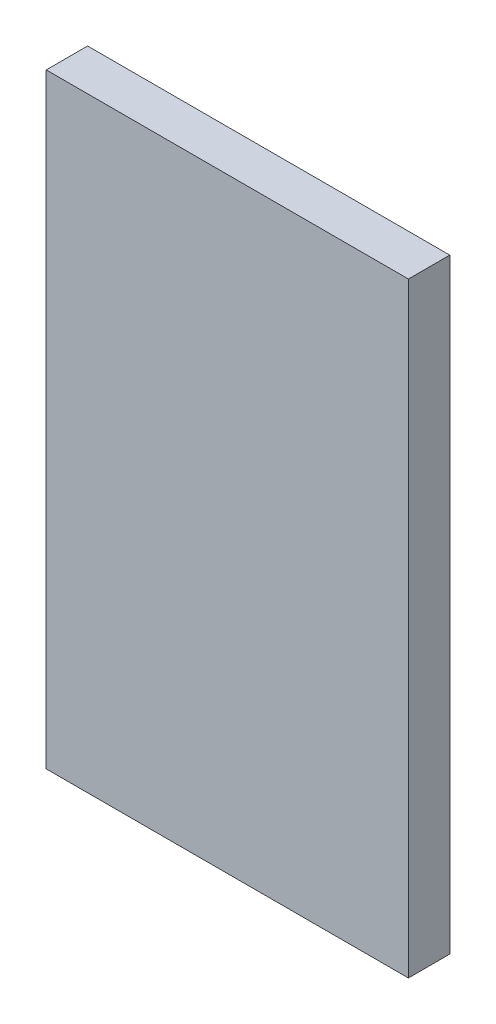
ISO-10303-21;
HEADER;
FILE_DESCRIPTION(('STEP AP214'),'2;1');
FILE_NAME('part.step','',(''),(''),'','','');
FILE_SCHEMA(('AUTOMOTIVE_DESIGN { 1 0 10303 214 1 1 1 1 }'));
ENDSEC;
DATA;
#1=APPLICATION_CONTEXT('core data for automotive mechanical design processes');
#2=APPLICATION_PROTOCOL_DEFINITION('international standard','automotive_design',2000,#1);
#3=PRODUCT_CONTEXT('',#1,'mechanical');
#4=PRODUCT('Part','Part','',(#3));
#5=PRODUCT_RELATED_PRODUCT_CATEGORY('part','',(#4));
#6=PRODUCT_DEFINITION_FORMATION('','',#4);
#7=PRODUCT_DEFINITION_CONTEXT('part definition',#1,'design');
#8=PRODUCT_DEFINITION('design','',#6,#7);
#9=PRODUCT_DEFINITION_SHAPE('','',#8);
#10=(LENGTH_UNIT() NAMED_UNIT(*) SI_UNIT(.MILLI.,.METRE.));
#11=(NAMED_UNIT(*) PLANE_ANGLE_UNIT() SI_UNIT($,.RADIAN.));
#12=(NAMED_UNIT(*) SI_UNIT($,.STERADIAN.) SOLID_ANGLE_UNIT());
#13=UNCERTAINTY_MEASURE_WITH_UNIT(LENGTH_MEASURE(1.E-05),#10,'distance_accuracy_value','');
#14=(GEOMETRIC_REPRESENTATION_CONTEXT(3) GLOBAL_UNCERTAINTY_ASSIGNED_CONTEXT((#13)) GLOBAL_UNIT_ASSIGNED_CONTEXT((#10,
#11,#12)) REPRESENTATION_CONTEXT('',''));
#15=CARTESIAN_POINT('',(0.,0.,0.));
#16=DIRECTION('',(0.,0.,1.));
#17=DIRECTION('',(1.,0.,0.));
#18=AXIS2_PLACEMENT_3D('',#15,#16,#17);
#19=CARTESIAN_POINT('',(-39.6843491918731,39.5751633986928,8.));
#20=DIRECTION('',(1.,0.,0.));
#21=DIRECTION('',(0.,1.,0.));
#22=AXIS2_PLACEMENT_3D('',#19,#20,#21);
#23=PLANE('',#22);
#24=DIRECTION('',(0.,-1.,0.));
#25=VECTOR('',#24,1.);
#26=CARTESIAN_POINT('',(-39.6843491918731,39.5751633986928,0.));
#27=LINE('',#26,#25);
#28=CARTESIAN_POINT('',(-39.6843491918731,39.5751633986928,0.));
#29=VERTEX_POINT('',#28);
#30=CARTESIAN_POINT('',(-39.6843491918731,-77.4248366013072,0.));
#31=VERTEX_POINT('',#30);
#32=EDGE_CURVE('E102',#29,#31,#27,.T.);
#33=ORIENTED_EDGE('',*,*,#32,.T.);
#34=DIRECTION('',(0.,0.,-1.));
#35=VECTOR('',#34,1.);
#36=CARTESIAN_POINT('',(-39.6843491918731,-77.4248366013072,8.));
#37=LINE('',#36,#35);
#38=CARTESIAN_POINT('',(-39.6843491918731,-77.4248366013072,8.));
#39=VERTEX_POINT('',#38);
#40=EDGE_CURVE('E11',#39,#31,#37,.T.);
#41=ORIENTED_EDGE('',*,*,#40,.F.);
#42=DIRECTION('',(0.,-1.,0.));
#43=VECTOR('',#42,1.);
#44=CARTESIAN_POINT('',(-39.6843491918731,39.5751633986928,8.));
#45=LINE('',#44,#43);
#46=CARTESIAN_POINT('',(-39.6843491918731,39.5751633986928,8.));
#47=VERTEX_POINT('',#46);
#48=EDGE_CURVE('E90',#47,#39,#45,.T.);
#49=ORIENTED_EDGE('',*,*,#48,.F.);
#50=DIRECTION('',(0.,0.,-1.));
#51=VECTOR('',#50,1.);
#52=CARTESIAN_POINT('',(-39.6843491918731,39.5751633986928,8.));
#53=LINE('',#52,#51);
#54=EDGE_CURVE('E98',#47,#29,#53,.T.);
#55=ORIENTED_EDGE('',*,*,#54,.T.);
#56=EDGE_LOOP('',(#33,#41,#49,#55));
#57=FACE_BOUND('',#56,.T.);
#58=ADVANCED_FACE('F39',(#57),#23,.F.);
#59=CARTESIAN_POINT('',(-39.6843491918731,-77.4248366013072,8.));
#60=DIRECTION('',(0.,1.,0.));
#61=DIRECTION('',(0.,0.,1.));
#62=AXIS2_PLACEMENT_3D('',#59,#60,#61);
#63=PLANE('',#62);
#64=DIRECTION('',(1.,0.,0.));
#65=VECTOR('',#64,1.);
#66=CARTESIAN_POINT('',(-39.6843491918731,-77.4248366013072,0.));
#67=LINE('',#66,#65);
#68=CARTESIAN_POINT('',(30.3156508081269,-77.4248366013072,0.));
#69=VERTEX_POINT('',#68);
#70=EDGE_CURVE('E94',#31,#69,#67,.T.);
#71=ORIENTED_EDGE('',*,*,#70,.T.);
#72=DIRECTION('',(0.,0.,-1.));
#73=VECTOR('',#72,1.);
#74=CARTESIAN_POINT('',(30.3156508081269,-77.4248366013072,8.));
#75=LINE('',#74,#73);
#76=CARTESIAN_POINT('',(30.3156508081269,-77.4248366013072,8.));
#77=VERTEX_POINT('',#76);
#78=EDGE_CURVE('E47',#77,#69,#75,.T.);
#79=ORIENTED_EDGE('',*,*,#78,.F.);
#80=DIRECTION('',(1.,0.,0.));
#81=VECTOR('',#80,1.);
#82=CARTESIAN_POINT('',(-39.6843491918731,-77.4248366013072,8.));
#83=LINE('',#82,#81);
#84=EDGE_CURVE('E85',#39,#77,#83,.T.);
#85=ORIENTED_EDGE('',*,*,#84,.F.);
#86=ORIENTED_EDGE('',*,*,#40,.T.);
#87=EDGE_LOOP('',(#71,#79,#85,#86));
#88=FACE_BOUND('',#87,.T.);
#89=ADVANCED_FACE('F93',(#88),#63,.F.);
#90=CARTESIAN_POINT('',(30.3156508081269,39.5751633986928,8.));
#91=DIRECTION('',(-1.,0.,0.));
#92=DIRECTION('',(0.,-1.,0.));
#93=AXIS2_PLACEMENT_3D('',#90,#91,#92);
#94=PLANE('',#93);
#95=DIRECTION('',(0.,1.,0.));
#96=VECTOR('',#95,1.);
#97=CARTESIAN_POINT('',(30.3156508081269,39.5751633986928,0.));
#98=LINE('',#97,#96);
#99=CARTESIAN_POINT('',(30.3156508081269,39.5751633986928,0.));
#100=VERTEX_POINT('',#99);
#101=EDGE_CURVE('E72',#69,#100,#98,.T.);
#102=ORIENTED_EDGE('',*,*,#101,.T.);
#103=DIRECTION('',(0.,0.,-1.));
#104=VECTOR('',#103,1.);
#105=CARTESIAN_POINT('',(30.3156508081269,39.5751633986928,8.));
#106=LINE('',#105,#104);
#107=CARTESIAN_POINT('',(30.3156508081269,39.5751633986928,8.));
#108=VERTEX_POINT('',#107);
#109=EDGE_CURVE('E95',#108,#100,#106,.T.);
#110=ORIENTED_EDGE('',*,*,#109,.F.);
#111=DIRECTION('',(0.,1.,0.));
#112=VECTOR('',#111,1.);
#113=CARTESIAN_POINT('',(30.3156508081269,39.5751633986928,8.));
#114=LINE('',#113,#112);
#115=EDGE_CURVE('E88',#77,#108,#114,.T.);
#116=ORIENTED_EDGE('',*,*,#115,.F.);
#117=ORIENTED_EDGE('',*,*,#78,.T.);
#118=EDGE_LOOP('',(#102,#110,#116,#117));
#119=FACE_BOUND('',#118,.T.);
#120=ADVANCED_FACE('F96',(#119),#94,.F.);
#121=CARTESIAN_POINT('',(-39.6843491918731,39.5751633986928,8.));
#122=DIRECTION('',(0.,-1.,0.));
#123=DIRECTION('',(0.,0.,-1.));
#124=AXIS2_PLACEMENT_3D('',#121,#122,#123);
#125=PLANE('',#124);
#126=DIRECTION('',(-1.,0.,0.));
#127=VECTOR('',#126,1.);
#128=CARTESIAN_POINT('',(-39.6843491918731,39.5751633986928,0.));
#129=LINE('',#128,#127);
#130=EDGE_CURVE('E78',#100,#29,#129,.T.);
#131=ORIENTED_EDGE('',*,*,#130,.T.);
#132=ORIENTED_EDGE('',*,*,#54,.F.);
#133=DIRECTION('',(-1.,0.,0.));
#134=VECTOR('',#133,1.);
#135=CARTESIAN_POINT('',(-39.6843491918731,39.5751633986928,8.));
#136=LINE('',#135,#134);
#137=EDGE_CURVE('E55',#108,#47,#136,.T.);
#138=ORIENTED_EDGE('',*,*,#137,.F.);
#139=ORIENTED_EDGE('',*,*,#109,.T.);
#140=EDGE_LOOP('',(#131,#132,#138,#139));
#141=FACE_BOUND('',#140,.T.);
#142=ADVANCED_FACE('F109',(#141),#125,.F.);
#143=CARTESIAN_POINT('',(0.,0.,8.));
#144=DIRECTION('',(0.,0.,1.));
#145=DIRECTION('',(1.,0.,0.));
#146=AXIS2_PLACEMENT_3D('',#143,#144,#145);
#147=PLANE('',#146);
#148=ORIENTED_EDGE('',*,*,#48,.T.);
#149=ORIENTED_EDGE('',*,*,#84,.T.);
#150=ORIENTED_EDGE('',*,*,#115,.T.);
#151=ORIENTED_EDGE('',*,*,#137,.T.);
#152=EDGE_LOOP('',(#148,#149,#150,#151));
#153=FACE_BOUND('',#152,.T.);
#154=ADVANCED_FACE('F86',(#153),#147,.T.);
#155=CARTESIAN_POINT('',(0.,0.,0.));
#156=DIRECTION('',(0.,0.,1.));
#157=DIRECTION('',(1.,0.,0.));
#158=AXIS2_PLACEMENT_3D('',#155,#156,#157);
#159=PLANE('',#158);
#160=ORIENTED_EDGE('',*,*,#32,.F.);
#161=ORIENTED_EDGE('',*,*,#130,.F.);
#162=ORIENTED_EDGE('',*,*,#101,.F.);
#163=ORIENTED_EDGE('',*,*,#70,.F.);
#164=EDGE_LOOP('',(#160,#161,#162,#163));
#165=FACE_BOUND('',#164,.T.);
#166=ADVANCED_FACE('F112',(#165),#159,.F.);
#167=CLOSED_SHELL('',(#58,#89,#120,#142,#154,#166));
#168=MANIFOLD_SOLID_BREP('B2',#167);
#169=ADVANCED_BREP_SHAPE_REPRESENTATION('',(#18,#168),#14);
#170=SHAPE_DEFINITION_REPRESENTATION(#9,#169);
ENDSEC;
END-ISO-10303-21;
